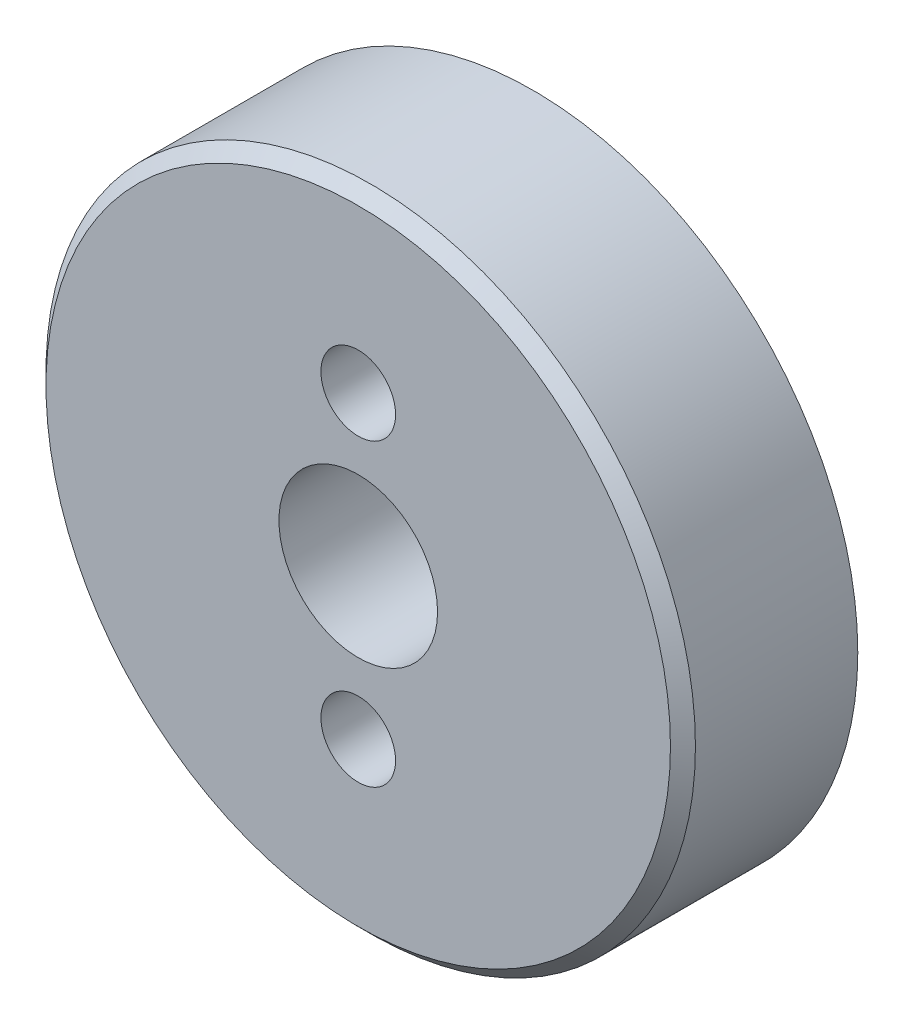
ISO-10303-21;
HEADER;
FILE_DESCRIPTION(('STEP AP214'),'2;1');
FILE_NAME('part.step','',(''),(''),'','','');
FILE_SCHEMA(('AUTOMOTIVE_DESIGN { 1 0 10303 214 1 1 1 1 }'));
ENDSEC;
DATA;
#1=APPLICATION_CONTEXT('core data for automotive mechanical design processes');
#2=APPLICATION_PROTOCOL_DEFINITION('international standard','automotive_design',2000,#1);
#3=PRODUCT_CONTEXT('',#1,'mechanical');
#4=PRODUCT('Part','Part','',(#3));
#5=PRODUCT_RELATED_PRODUCT_CATEGORY('part','',(#4));
#6=PRODUCT_DEFINITION_FORMATION('','',#4);
#7=PRODUCT_DEFINITION_CONTEXT('part definition',#1,'design');
#8=PRODUCT_DEFINITION('design','',#6,#7);
#9=PRODUCT_DEFINITION_SHAPE('','',#8);
#10=(LENGTH_UNIT() NAMED_UNIT(*) SI_UNIT(.MILLI.,.METRE.));
#11=(NAMED_UNIT(*) PLANE_ANGLE_UNIT() SI_UNIT($,.RADIAN.));
#12=(NAMED_UNIT(*) SI_UNIT($,.STERADIAN.) SOLID_ANGLE_UNIT());
#13=UNCERTAINTY_MEASURE_WITH_UNIT(LENGTH_MEASURE(1.E-05),#10,'distance_accuracy_value','');
#14=(GEOMETRIC_REPRESENTATION_CONTEXT(3) GLOBAL_UNCERTAINTY_ASSIGNED_CONTEXT((#13)) GLOBAL_UNIT_ASSIGNED_CONTEXT((#10,
#11,#12)) REPRESENTATION_CONTEXT('',''));
#15=CARTESIAN_POINT('',(0.,0.,0.));
#16=DIRECTION('',(0.,0.,1.));
#17=DIRECTION('',(1.,0.,0.));
#18=AXIS2_PLACEMENT_3D('',#15,#16,#17);
#19=CARTESIAN_POINT('',(0.,0.,7.));
#20=DIRECTION('',(0.,0.,1.));
#21=DIRECTION('',(1.,0.,0.));
#22=AXIS2_PLACEMENT_3D('',#19,#20,#21);
#23=PLANE('',#22);
#24=CARTESIAN_POINT('',(0.,0.,7.));
#25=DIRECTION('',(0.,0.,1.));
#26=DIRECTION('',(1.,0.,0.));
#27=AXIS2_PLACEMENT_3D('',#24,#25,#26);
#28=CIRCLE('',#27,12.5);
#29=CARTESIAN_POINT('',(12.5,0.,7.));
#30=VERTEX_POINT('',#29);
#31=EDGE_CURVE('E35',#30,#30,#28,.T.);
#32=ORIENTED_EDGE('',*,*,#31,.T.);
#33=EDGE_LOOP('',(#32));
#34=FACE_BOUND('',#33,.T.);
#35=CARTESIAN_POINT('',(0.,6.,7.));
#36=DIRECTION('',(0.,0.,1.));
#37=DIRECTION('',(1.,0.,0.));
#38=AXIS2_PLACEMENT_3D('',#35,#36,#37);
#39=CIRCLE('',#38,1.49440531887485);
#40=CARTESIAN_POINT('',(1.49440531887485,6.,7.));
#41=VERTEX_POINT('',#40);
#42=EDGE_CURVE('E49',#41,#41,#39,.T.);
#43=ORIENTED_EDGE('',*,*,#42,.F.);
#44=EDGE_LOOP('',(#43));
#45=FACE_BOUND('',#44,.T.);
#46=CARTESIAN_POINT('',(0.,0.,7.));
#47=DIRECTION('',(0.,0.,1.));
#48=DIRECTION('',(1.,0.,0.));
#49=AXIS2_PLACEMENT_3D('',#46,#47,#48);
#50=CIRCLE('',#49,3.175);
#51=CARTESIAN_POINT('',(3.175,0.,7.));
#52=VERTEX_POINT('',#51);
#53=EDGE_CURVE('E43',#52,#52,#50,.T.);
#54=ORIENTED_EDGE('',*,*,#53,.F.);
#55=EDGE_LOOP('',(#54));
#56=FACE_BOUND('',#55,.T.);
#57=CARTESIAN_POINT('',(0.,-6.,7.));
#58=DIRECTION('',(0.,0.,1.));
#59=DIRECTION('',(1.,0.,0.));
#60=AXIS2_PLACEMENT_3D('',#57,#58,#59);
#61=CIRCLE('',#60,1.49440531887485);
#62=CARTESIAN_POINT('',(1.49440531887481,-6.,7.));
#63=VERTEX_POINT('',#62);
#64=EDGE_CURVE('E55',#63,#63,#61,.T.);
#65=ORIENTED_EDGE('',*,*,#64,.F.);
#66=EDGE_LOOP('',(#65));
#67=FACE_BOUND('',#66,.T.);
#68=ADVANCED_FACE('F28',(#34,#45,#56,#67),#23,.T.);
#69=CARTESIAN_POINT('',(0.,0.,0.));
#70=DIRECTION('',(0.,0.,1.));
#71=DIRECTION('',(1.,0.,0.));
#72=AXIS2_PLACEMENT_3D('',#69,#70,#71);
#73=PLANE('',#72);
#74=CARTESIAN_POINT('',(0.,6.,0.));
#75=DIRECTION('',(0.,0.,1.));
#76=DIRECTION('',(1.,0.,0.));
#77=AXIS2_PLACEMENT_3D('',#74,#75,#76);
#78=CIRCLE('',#77,1.49440531887485);
#79=CARTESIAN_POINT('',(1.49440531887485,6.,0.));
#80=VERTEX_POINT('',#79);
#81=EDGE_CURVE('E52',#80,#80,#78,.T.);
#82=ORIENTED_EDGE('',*,*,#81,.T.);
#83=EDGE_LOOP('',(#82));
#84=FACE_BOUND('',#83,.T.);
#85=CARTESIAN_POINT('',(0.,0.,0.));
#86=DIRECTION('',(0.,0.,1.));
#87=DIRECTION('',(1.,0.,0.));
#88=AXIS2_PLACEMENT_3D('',#85,#86,#87);
#89=CIRCLE('',#88,13.);
#90=CARTESIAN_POINT('',(13.,0.,0.));
#91=VERTEX_POINT('',#90);
#92=EDGE_CURVE('E39',#91,#91,#89,.T.);
#93=ORIENTED_EDGE('',*,*,#92,.F.);
#94=EDGE_LOOP('',(#93));
#95=FACE_BOUND('',#94,.T.);
#96=CARTESIAN_POINT('',(0.,0.,0.));
#97=DIRECTION('',(0.,0.,1.));
#98=DIRECTION('',(1.,0.,0.));
#99=AXIS2_PLACEMENT_3D('',#96,#97,#98);
#100=CIRCLE('',#99,3.175);
#101=CARTESIAN_POINT('',(3.175,0.,0.));
#102=VERTEX_POINT('',#101);
#103=EDGE_CURVE('E46',#102,#102,#100,.T.);
#104=ORIENTED_EDGE('',*,*,#103,.T.);
#105=EDGE_LOOP('',(#104));
#106=FACE_BOUND('',#105,.T.);
#107=CARTESIAN_POINT('',(0.,-6.,0.));
#108=DIRECTION('',(0.,0.,1.));
#109=DIRECTION('',(1.,0.,0.));
#110=AXIS2_PLACEMENT_3D('',#107,#108,#109);
#111=CIRCLE('',#110,1.49440531887485);
#112=CARTESIAN_POINT('',(1.49440531887481,-6.,0.));
#113=VERTEX_POINT('',#112);
#114=EDGE_CURVE('E58',#113,#113,#111,.T.);
#115=ORIENTED_EDGE('',*,*,#114,.T.);
#116=EDGE_LOOP('',(#115));
#117=FACE_BOUND('',#116,.T.);
#118=ADVANCED_FACE('F68',(#84,#95,#106,#117),#73,.F.);
#119=CARTESIAN_POINT('',(0.,0.,7.));
#120=DIRECTION('',(0.,0.,-1.));
#121=DIRECTION('',(-1.,0.,0.));
#122=AXIS2_PLACEMENT_3D('',#119,#120,#121);
#123=CYLINDRICAL_SURFACE('',#122,13.);
#124=CARTESIAN_POINT('',(0.,0.,6.5));
#125=DIRECTION('',(0.,0.,1.));
#126=DIRECTION('',(1.,0.,0.));
#127=AXIS2_PLACEMENT_3D('',#124,#125,#126);
#128=CIRCLE('',#127,13.);
#129=CARTESIAN_POINT('',(13.,0.,6.5));
#130=VERTEX_POINT('',#129);
#131=EDGE_CURVE('E10',#130,#130,#128,.F.);
#132=ORIENTED_EDGE('',*,*,#131,.T.);
#133=EDGE_LOOP('',(#132));
#134=FACE_BOUND('',#133,.T.);
#135=ORIENTED_EDGE('',*,*,#92,.T.);
#136=EDGE_LOOP('',(#135));
#137=FACE_BOUND('',#136,.T.);
#138=ADVANCED_FACE('F73',(#134,#137),#123,.T.);
#139=CARTESIAN_POINT('',(0.,0.,7.));
#140=DIRECTION('',(0.,0.,-1.));
#141=DIRECTION('',(-1.,0.,0.));
#142=AXIS2_PLACEMENT_3D('',#139,#140,#141);
#143=CYLINDRICAL_SURFACE('',#142,3.175);
#144=ORIENTED_EDGE('',*,*,#53,.T.);
#145=EDGE_LOOP('',(#144));
#146=FACE_BOUND('',#145,.T.);
#147=ORIENTED_EDGE('',*,*,#103,.F.);
#148=EDGE_LOOP('',(#147));
#149=FACE_BOUND('',#148,.T.);
#150=ADVANCED_FACE('F78',(#146,#149),#143,.F.);
#151=CARTESIAN_POINT('',(0.,6.,7.));
#152=DIRECTION('',(0.,0.,-1.));
#153=DIRECTION('',(-1.,0.,0.));
#154=AXIS2_PLACEMENT_3D('',#151,#152,#153);
#155=CYLINDRICAL_SURFACE('',#154,1.49440531887485);
#156=ORIENTED_EDGE('',*,*,#42,.T.);
#157=EDGE_LOOP('',(#156));
#158=FACE_BOUND('',#157,.T.);
#159=ORIENTED_EDGE('',*,*,#81,.F.);
#160=EDGE_LOOP('',(#159));
#161=FACE_BOUND('',#160,.T.);
#162=ADVANCED_FACE('F84',(#158,#161),#155,.F.);
#163=CARTESIAN_POINT('',(0.,-6.,7.));
#164=DIRECTION('',(0.,0.,-1.));
#165=DIRECTION('',(-1.,0.,0.));
#166=AXIS2_PLACEMENT_3D('',#163,#164,#165);
#167=CYLINDRICAL_SURFACE('',#166,1.49440531887485);
#168=ORIENTED_EDGE('',*,*,#64,.T.);
#169=EDGE_LOOP('',(#168));
#170=FACE_BOUND('',#169,.T.);
#171=ORIENTED_EDGE('',*,*,#114,.F.);
#172=EDGE_LOOP('',(#171));
#173=FACE_BOUND('',#172,.T.);
#174=ADVANCED_FACE('F64',(#170,#173),#167,.F.);
#175=CARTESIAN_POINT('',(0.,0.,7.));
#176=DIRECTION('',(0.,0.,-1.));
#177=DIRECTION('',(-1.,0.,0.));
#178=AXIS2_PLACEMENT_3D('',#175,#176,#177);
#179=CONICAL_SURFACE('',#178,12.5,0.785398163397448);
#180=ORIENTED_EDGE('',*,*,#131,.F.);
#181=EDGE_LOOP('',(#180));
#182=FACE_BOUND('',#181,.T.);
#183=ORIENTED_EDGE('',*,*,#31,.F.);
#184=EDGE_LOOP('',(#183));
#185=FACE_BOUND('',#184,.T.);
#186=ADVANCED_FACE('F30',(#182,#185),#179,.T.);
#187=CLOSED_SHELL('',(#68,#118,#138,#150,#162,#174,#186));
#188=MANIFOLD_SOLID_BREP('B2',#187);
#189=ADVANCED_BREP_SHAPE_REPRESENTATION('',(#18,#188),#14);
#190=SHAPE_DEFINITION_REPRESENTATION(#9,#189);
ENDSEC;
END-ISO-10303-21;
